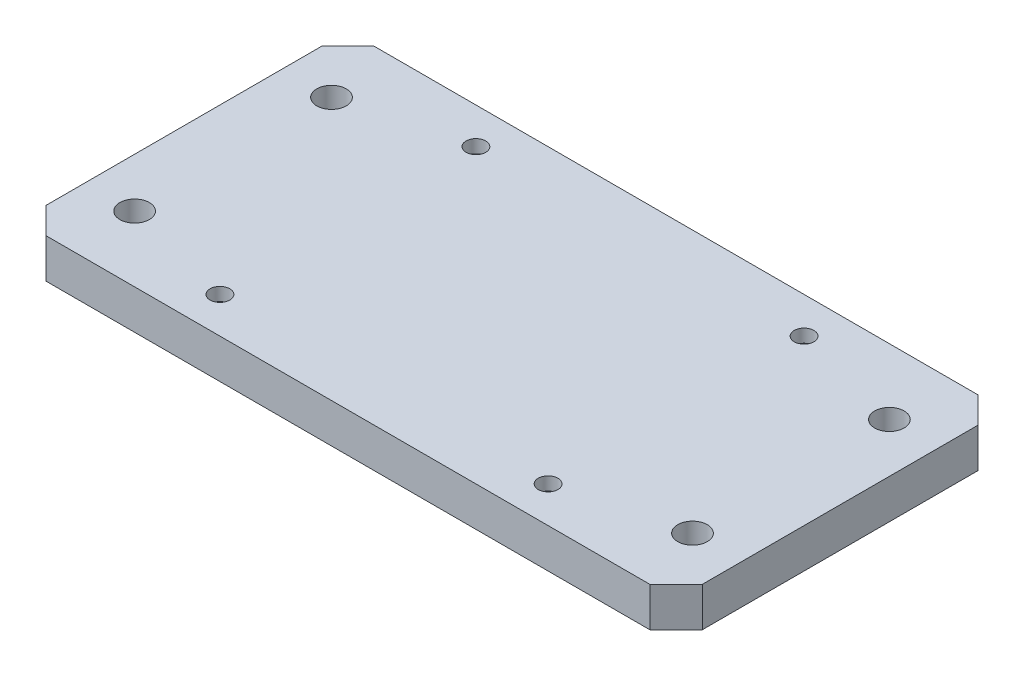
ISO-10303-21;
HEADER;
FILE_DESCRIPTION(('STEP AP214'),'2;1');
FILE_NAME('part.step','',(''),(''),'','','');
FILE_SCHEMA(('AUTOMOTIVE_DESIGN { 1 0 10303 214 1 1 1 1 }'));
ENDSEC;
DATA;
#1=APPLICATION_CONTEXT('core data for automotive mechanical design processes');
#2=APPLICATION_PROTOCOL_DEFINITION('international standard','automotive_design',2000,#1);
#3=PRODUCT_CONTEXT('',#1,'mechanical');
#4=PRODUCT('Part','Part','',(#3));
#5=PRODUCT_RELATED_PRODUCT_CATEGORY('part','',(#4));
#6=PRODUCT_DEFINITION_FORMATION('','',#4);
#7=PRODUCT_DEFINITION_CONTEXT('part definition',#1,'design');
#8=PRODUCT_DEFINITION('design','',#6,#7);
#9=PRODUCT_DEFINITION_SHAPE('','',#8);
#10=(LENGTH_UNIT() NAMED_UNIT(*) SI_UNIT(.MILLI.,.METRE.));
#11=(NAMED_UNIT(*) PLANE_ANGLE_UNIT() SI_UNIT($,.RADIAN.));
#12=(NAMED_UNIT(*) SI_UNIT($,.STERADIAN.) SOLID_ANGLE_UNIT());
#13=UNCERTAINTY_MEASURE_WITH_UNIT(LENGTH_MEASURE(1.E-05),#10,'distance_accuracy_value','');
#14=(GEOMETRIC_REPRESENTATION_CONTEXT(3) GLOBAL_UNCERTAINTY_ASSIGNED_CONTEXT((#13)) GLOBAL_UNIT_ASSIGNED_CONTEXT((#10,
#11,#12)) REPRESENTATION_CONTEXT('',''));
#15=CARTESIAN_POINT('',(0.,0.,0.));
#16=DIRECTION('',(0.,0.,1.));
#17=DIRECTION('',(1.,0.,0.));
#18=AXIS2_PLACEMENT_3D('',#15,#16,#17);
#19=CARTESIAN_POINT('',(-200.,12.,-50.));
#20=DIRECTION('',(1.,0.,0.));
#21=DIRECTION('',(0.,0.,-1.));
#22=AXIS2_PLACEMENT_3D('',#19,#20,#21);
#23=PLANE('',#22);
#24=DIRECTION('',(0.,0.,1.));
#25=VECTOR('',#24,1.);
#26=CARTESIAN_POINT('',(-200.,12.,-50.));
#27=LINE('',#26,#25);
#28=CARTESIAN_POINT('',(-200.,12.,-42.));
#29=VERTEX_POINT('',#28);
#30=CARTESIAN_POINT('',(-200.,12.,42.));
#31=VERTEX_POINT('',#30);
#32=EDGE_CURVE('E127',#29,#31,#27,.T.);
#33=ORIENTED_EDGE('',*,*,#32,.F.);
#34=DIRECTION('',(0.,-1.,0.));
#35=VECTOR('',#34,1.);
#36=CARTESIAN_POINT('',(-200.,12.,-42.));
#37=LINE('',#36,#35);
#38=CARTESIAN_POINT('',(-200.,0.,-42.));
#39=VERTEX_POINT('',#38);
#40=EDGE_CURVE('E11',#29,#39,#37,.T.);
#41=ORIENTED_EDGE('',*,*,#40,.T.);
#42=DIRECTION('',(0.,0.,1.));
#43=VECTOR('',#42,1.);
#44=CARTESIAN_POINT('',(-200.,0.,-50.));
#45=LINE('',#44,#43);
#46=CARTESIAN_POINT('',(-200.,0.,42.));
#47=VERTEX_POINT('',#46);
#48=EDGE_CURVE('E129',#39,#47,#45,.T.);
#49=ORIENTED_EDGE('',*,*,#48,.T.);
#50=DIRECTION('',(0.,1.,0.));
#51=VECTOR('',#50,1.);
#52=CARTESIAN_POINT('',(-200.,12.,42.));
#53=LINE('',#52,#51);
#54=EDGE_CURVE('E40',#47,#31,#53,.T.);
#55=ORIENTED_EDGE('',*,*,#54,.T.);
#56=EDGE_LOOP('',(#33,#41,#49,#55));
#57=FACE_BOUND('',#56,.T.);
#58=ADVANCED_FACE('F32',(#57),#23,.F.);
#59=CARTESIAN_POINT('',(-200.,12.,50.));
#60=DIRECTION('',(0.,0.,-1.));
#61=DIRECTION('',(-1.,0.,0.));
#62=AXIS2_PLACEMENT_3D('',#59,#60,#61);
#63=PLANE('',#62);
#64=DIRECTION('',(1.,0.,0.));
#65=VECTOR('',#64,1.);
#66=CARTESIAN_POINT('',(-200.,0.,50.));
#67=LINE('',#66,#65);
#68=CARTESIAN_POINT('',(-192.,0.,50.));
#69=VERTEX_POINT('',#68);
#70=CARTESIAN_POINT('',(-8.00000000000004,0.,50.));
#71=VERTEX_POINT('',#70);
#72=EDGE_CURVE('E125',#69,#71,#67,.T.);
#73=ORIENTED_EDGE('',*,*,#72,.T.);
#74=DIRECTION('',(0.,1.,0.));
#75=VECTOR('',#74,1.);
#76=CARTESIAN_POINT('',(-8.00000000000004,12.,50.));
#77=LINE('',#76,#75);
#78=CARTESIAN_POINT('',(-7.99999999999999,12.,50.));
#79=VERTEX_POINT('',#78);
#80=EDGE_CURVE('E104',#71,#79,#77,.T.);
#81=ORIENTED_EDGE('',*,*,#80,.T.);
#82=DIRECTION('',(1.,0.,0.));
#83=VECTOR('',#82,1.);
#84=CARTESIAN_POINT('',(-200.,12.,50.));
#85=LINE('',#84,#83);
#86=CARTESIAN_POINT('',(-192.,12.,50.));
#87=VERTEX_POINT('',#86);
#88=EDGE_CURVE('E165',#87,#79,#85,.T.);
#89=ORIENTED_EDGE('',*,*,#88,.F.);
#90=DIRECTION('',(0.,-1.,0.));
#91=VECTOR('',#90,1.);
#92=CARTESIAN_POINT('',(-192.,12.,50.));
#93=LINE('',#92,#91);
#94=EDGE_CURVE('E109',#87,#69,#93,.T.);
#95=ORIENTED_EDGE('',*,*,#94,.T.);
#96=EDGE_LOOP('',(#73,#81,#89,#95));
#97=FACE_BOUND('',#96,.T.);
#98=ADVANCED_FACE('F169',(#97),#63,.F.);
#99=CARTESIAN_POINT('',(0.,12.,-50.));
#100=DIRECTION('',(-1.,0.,0.));
#101=DIRECTION('',(0.,0.,1.));
#102=AXIS2_PLACEMENT_3D('',#99,#100,#101);
#103=PLANE('',#102);
#104=DIRECTION('',(0.,0.,-1.));
#105=VECTOR('',#104,1.);
#106=CARTESIAN_POINT('',(0.,12.,-50.));
#107=LINE('',#106,#105);
#108=CARTESIAN_POINT('',(0.,12.,42.));
#109=VERTEX_POINT('',#108);
#110=CARTESIAN_POINT('',(0.,12.,-42.));
#111=VERTEX_POINT('',#110);
#112=EDGE_CURVE('E118',#109,#111,#107,.T.);
#113=ORIENTED_EDGE('',*,*,#112,.F.);
#114=DIRECTION('',(0.,-1.,0.));
#115=VECTOR('',#114,1.);
#116=CARTESIAN_POINT('',(0.,12.,42.));
#117=LINE('',#116,#115);
#118=CARTESIAN_POINT('',(0.,0.,42.));
#119=VERTEX_POINT('',#118);
#120=EDGE_CURVE('E103',#109,#119,#117,.T.);
#121=ORIENTED_EDGE('',*,*,#120,.T.);
#122=DIRECTION('',(0.,0.,-1.));
#123=VECTOR('',#122,1.);
#124=CARTESIAN_POINT('',(0.,0.,-50.));
#125=LINE('',#124,#123);
#126=CARTESIAN_POINT('',(0.,0.,-42.));
#127=VERTEX_POINT('',#126);
#128=EDGE_CURVE('E116',#119,#127,#125,.T.);
#129=ORIENTED_EDGE('',*,*,#128,.T.);
#130=DIRECTION('',(0.,1.,0.));
#131=VECTOR('',#130,1.);
#132=CARTESIAN_POINT('',(0.,12.,-42.));
#133=LINE('',#132,#131);
#134=EDGE_CURVE('E120',#127,#111,#133,.T.);
#135=ORIENTED_EDGE('',*,*,#134,.T.);
#136=EDGE_LOOP('',(#113,#121,#129,#135));
#137=FACE_BOUND('',#136,.T.);
#138=ADVANCED_FACE('F115',(#137),#103,.F.);
#139=CARTESIAN_POINT('',(-200.,12.,-50.));
#140=DIRECTION('',(0.,0.,1.));
#141=DIRECTION('',(1.,0.,0.));
#142=AXIS2_PLACEMENT_3D('',#139,#140,#141);
#143=PLANE('',#142);
#144=DIRECTION('',(-1.,0.,0.));
#145=VECTOR('',#144,1.);
#146=CARTESIAN_POINT('',(-200.,12.,-50.));
#147=LINE('',#146,#145);
#148=CARTESIAN_POINT('',(-8.00000000000006,12.,-50.));
#149=VERTEX_POINT('',#148);
#150=CARTESIAN_POINT('',(-192.,12.,-50.));
#151=VERTEX_POINT('',#150);
#152=EDGE_CURVE('E133',#149,#151,#147,.T.);
#153=ORIENTED_EDGE('',*,*,#152,.F.);
#154=DIRECTION('',(0.,-1.,0.));
#155=VECTOR('',#154,1.);
#156=CARTESIAN_POINT('',(-8.00000000000004,12.,-50.));
#157=LINE('',#156,#155);
#158=CARTESIAN_POINT('',(-8.00000000000006,0.,-50.));
#159=VERTEX_POINT('',#158);
#160=EDGE_CURVE('E150',#149,#159,#157,.T.);
#161=ORIENTED_EDGE('',*,*,#160,.T.);
#162=DIRECTION('',(-1.,0.,0.));
#163=VECTOR('',#162,1.);
#164=CARTESIAN_POINT('',(-200.,0.,-50.));
#165=LINE('',#164,#163);
#166=CARTESIAN_POINT('',(-192.,0.,-50.));
#167=VERTEX_POINT('',#166);
#168=EDGE_CURVE('E124',#159,#167,#165,.T.);
#169=ORIENTED_EDGE('',*,*,#168,.T.);
#170=DIRECTION('',(0.,1.,0.));
#171=VECTOR('',#170,1.);
#172=CARTESIAN_POINT('',(-192.,12.,-50.));
#173=LINE('',#172,#171);
#174=EDGE_CURVE('E47',#167,#151,#173,.T.);
#175=ORIENTED_EDGE('',*,*,#174,.T.);
#176=EDGE_LOOP('',(#153,#161,#169,#175));
#177=FACE_BOUND('',#176,.T.);
#178=ADVANCED_FACE('F274',(#177),#143,.F.);
#179=CARTESIAN_POINT('',(-200.,12.,50.));
#180=DIRECTION('',(0.,1.,0.));
#181=DIRECTION('',(0.,0.,1.));
#182=AXIS2_PLACEMENT_3D('',#179,#180,#181);
#183=PLANE('',#182);
#184=CARTESIAN_POINT('',(-150.,12.,39.));
#185=DIRECTION('',(0.,-1.,0.));
#186=DIRECTION('',(0.,0.,-1.));
#187=AXIS2_PLACEMENT_3D('',#184,#185,#186);
#188=CIRCLE('',#187,3.);
#189=CARTESIAN_POINT('',(-150.,12.,36.));
#190=VERTEX_POINT('',#189);
#191=EDGE_CURVE('E234',#190,#190,#188,.T.);
#192=ORIENTED_EDGE('',*,*,#191,.T.);
#193=EDGE_LOOP('',(#192));
#194=FACE_BOUND('',#193,.T.);
#195=CARTESIAN_POINT('',(-50.,12.,39.));
#196=DIRECTION('',(0.,-1.,0.));
#197=DIRECTION('',(0.,0.,-1.));
#198=AXIS2_PLACEMENT_3D('',#195,#196,#197);
#199=CIRCLE('',#198,3.);
#200=CARTESIAN_POINT('',(-50.,12.,36.));
#201=VERTEX_POINT('',#200);
#202=EDGE_CURVE('E222',#201,#201,#199,.T.);
#203=ORIENTED_EDGE('',*,*,#202,.T.);
#204=EDGE_LOOP('',(#203));
#205=FACE_BOUND('',#204,.T.);
#206=CARTESIAN_POINT('',(-150.,12.,-39.));
#207=DIRECTION('',(0.,-1.,0.));
#208=DIRECTION('',(0.,0.,-1.));
#209=AXIS2_PLACEMENT_3D('',#206,#207,#208);
#210=CIRCLE('',#209,3.);
#211=CARTESIAN_POINT('',(-150.,12.,-42.));
#212=VERTEX_POINT('',#211);
#213=EDGE_CURVE('E210',#212,#212,#210,.T.);
#214=ORIENTED_EDGE('',*,*,#213,.T.);
#215=EDGE_LOOP('',(#214));
#216=FACE_BOUND('',#215,.T.);
#217=CARTESIAN_POINT('',(-50.,12.,-39.));
#218=DIRECTION('',(0.,-1.,0.));
#219=DIRECTION('',(0.,0.,-1.));
#220=AXIS2_PLACEMENT_3D('',#217,#218,#219);
#221=CIRCLE('',#220,3.);
#222=CARTESIAN_POINT('',(-50.,12.,-42.));
#223=VERTEX_POINT('',#222);
#224=EDGE_CURVE('E198',#223,#223,#221,.T.);
#225=ORIENTED_EDGE('',*,*,#224,.T.);
#226=EDGE_LOOP('',(#225));
#227=FACE_BOUND('',#226,.T.);
#228=CARTESIAN_POINT('',(-185.,12.,30.));
#229=DIRECTION('',(0.,1.,0.));
#230=DIRECTION('',(0.,0.,1.));
#231=AXIS2_PLACEMENT_3D('',#228,#229,#230);
#232=CIRCLE('',#231,4.49999999999998);
#233=CARTESIAN_POINT('',(-185.,12.,34.5));
#234=VERTEX_POINT('',#233);
#235=EDGE_CURVE('E195',#234,#234,#232,.T.);
#236=ORIENTED_EDGE('',*,*,#235,.F.);
#237=EDGE_LOOP('',(#236));
#238=FACE_BOUND('',#237,.T.);
#239=CARTESIAN_POINT('',(-15.,12.,30.));
#240=DIRECTION('',(0.,1.,0.));
#241=DIRECTION('',(0.,0.,1.));
#242=AXIS2_PLACEMENT_3D('',#239,#240,#241);
#243=CIRCLE('',#242,4.49999999999999);
#244=CARTESIAN_POINT('',(-15.,12.,34.5));
#245=VERTEX_POINT('',#244);
#246=EDGE_CURVE('E189',#245,#245,#243,.T.);
#247=ORIENTED_EDGE('',*,*,#246,.F.);
#248=EDGE_LOOP('',(#247));
#249=FACE_BOUND('',#248,.T.);
#250=CARTESIAN_POINT('',(-15.,12.,-30.));
#251=DIRECTION('',(0.,1.,0.));
#252=DIRECTION('',(0.,0.,1.));
#253=AXIS2_PLACEMENT_3D('',#250,#251,#252);
#254=CIRCLE('',#253,4.49999999999999);
#255=CARTESIAN_POINT('',(-15.,12.,-25.5));
#256=VERTEX_POINT('',#255);
#257=EDGE_CURVE('E183',#256,#256,#254,.T.);
#258=ORIENTED_EDGE('',*,*,#257,.F.);
#259=EDGE_LOOP('',(#258));
#260=FACE_BOUND('',#259,.T.);
#261=CARTESIAN_POINT('',(-185.,12.,-30.));
#262=DIRECTION('',(0.,1.,0.));
#263=DIRECTION('',(0.,0.,1.));
#264=AXIS2_PLACEMENT_3D('',#261,#262,#263);
#265=CIRCLE('',#264,4.49999999999998);
#266=CARTESIAN_POINT('',(-185.,12.,-25.5));
#267=VERTEX_POINT('',#266);
#268=EDGE_CURVE('E172',#267,#267,#265,.T.);
#269=ORIENTED_EDGE('',*,*,#268,.F.);
#270=EDGE_LOOP('',(#269));
#271=FACE_BOUND('',#270,.T.);
#272=ORIENTED_EDGE('',*,*,#88,.T.);
#273=DIRECTION('',(-0.707106781186548,0.,0.707106781186547));
#274=VECTOR('',#273,1.);
#275=CARTESIAN_POINT('',(-104.,12.,146.));
#276=LINE('',#275,#274);
#277=EDGE_CURVE('E147',#79,#109,#276,.F.);
#278=ORIENTED_EDGE('',*,*,#277,.T.);
#279=ORIENTED_EDGE('',*,*,#112,.T.);
#280=DIRECTION('',(0.707106781186547,0.,0.707106781186548));
#281=VECTOR('',#280,1.);
#282=CARTESIAN_POINT('',(-53.9999999999999,12.,-95.9999999999999));
#283=LINE('',#282,#281);
#284=EDGE_CURVE('E54',#111,#149,#283,.F.);
#285=ORIENTED_EDGE('',*,*,#284,.T.);
#286=ORIENTED_EDGE('',*,*,#152,.T.);
#287=DIRECTION('',(0.707106781186548,0.,-0.707106781186548));
#288=VECTOR('',#287,1.);
#289=CARTESIAN_POINT('',(-246.,12.,4.00000000000002));
#290=LINE('',#289,#288);
#291=EDGE_CURVE('E144',#151,#29,#290,.F.);
#292=ORIENTED_EDGE('',*,*,#291,.T.);
#293=ORIENTED_EDGE('',*,*,#32,.T.);
#294=DIRECTION('',(-0.707106781186549,0.,-0.707106781186546));
#295=VECTOR('',#294,1.);
#296=CARTESIAN_POINT('',(-196.,12.,46.));
#297=LINE('',#296,#295);
#298=EDGE_CURVE('E142',#31,#87,#297,.F.);
#299=ORIENTED_EDGE('',*,*,#298,.T.);
#300=EDGE_LOOP('',(#272,#278,#279,#285,#286,#292,#293,#299));
#301=FACE_BOUND('',#300,.T.);
#302=ADVANCED_FACE('F162',(#194,#205,#216,#227,#238,#249,#260,#271,#301),#183,.T.);
#303=CARTESIAN_POINT('',(-200.,0.,50.));
#304=DIRECTION('',(0.,1.,0.));
#305=DIRECTION('',(0.,0.,1.));
#306=AXIS2_PLACEMENT_3D('',#303,#304,#305);
#307=PLANE('',#306);
#308=CARTESIAN_POINT('',(-150.,0.,39.));
#309=DIRECTION('',(0.,-1.,0.));
#310=DIRECTION('',(0.,0.,-1.));
#311=AXIS2_PLACEMENT_3D('',#308,#309,#310);
#312=CIRCLE('',#311,5.50000000000001);
#313=CARTESIAN_POINT('',(-150.,0.,33.4999999999999));
#314=VERTEX_POINT('',#313);
#315=EDGE_CURVE('E243',#314,#314,#312,.T.);
#316=ORIENTED_EDGE('',*,*,#315,.F.);
#317=EDGE_LOOP('',(#316));
#318=FACE_BOUND('',#317,.T.);
#319=CARTESIAN_POINT('',(-50.,0.,39.));
#320=DIRECTION('',(0.,-1.,0.));
#321=DIRECTION('',(0.,0.,-1.));
#322=AXIS2_PLACEMENT_3D('',#319,#320,#321);
#323=CIRCLE('',#322,5.5);
#324=CARTESIAN_POINT('',(-50.,0.,33.5));
#325=VERTEX_POINT('',#324);
#326=EDGE_CURVE('E231',#325,#325,#323,.T.);
#327=ORIENTED_EDGE('',*,*,#326,.F.);
#328=EDGE_LOOP('',(#327));
#329=FACE_BOUND('',#328,.T.);
#330=CARTESIAN_POINT('',(-150.,0.,-39.));
#331=DIRECTION('',(0.,-1.,0.));
#332=DIRECTION('',(0.,0.,-1.));
#333=AXIS2_PLACEMENT_3D('',#330,#331,#332);
#334=CIRCLE('',#333,5.50000000000001);
#335=CARTESIAN_POINT('',(-150.,0.,-44.5));
#336=VERTEX_POINT('',#335);
#337=EDGE_CURVE('E219',#336,#336,#334,.T.);
#338=ORIENTED_EDGE('',*,*,#337,.F.);
#339=EDGE_LOOP('',(#338));
#340=FACE_BOUND('',#339,.T.);
#341=CARTESIAN_POINT('',(-50.,0.,-39.));
#342=DIRECTION('',(0.,-1.,0.));
#343=DIRECTION('',(0.,0.,-1.));
#344=AXIS2_PLACEMENT_3D('',#341,#342,#343);
#345=CIRCLE('',#344,5.5);
#346=CARTESIAN_POINT('',(-50.,0.,-44.5));
#347=VERTEX_POINT('',#346);
#348=EDGE_CURVE('E207',#347,#347,#345,.T.);
#349=ORIENTED_EDGE('',*,*,#348,.F.);
#350=EDGE_LOOP('',(#349));
#351=FACE_BOUND('',#350,.T.);
#352=CARTESIAN_POINT('',(-185.,0.,30.));
#353=DIRECTION('',(0.,1.,0.));
#354=DIRECTION('',(0.,0.,1.));
#355=AXIS2_PLACEMENT_3D('',#352,#353,#354);
#356=CIRCLE('',#355,4.5);
#357=CARTESIAN_POINT('',(-185.,0.,34.5));
#358=VERTEX_POINT('',#357);
#359=EDGE_CURVE('E192',#358,#358,#356,.T.);
#360=ORIENTED_EDGE('',*,*,#359,.T.);
#361=EDGE_LOOP('',(#360));
#362=FACE_BOUND('',#361,.T.);
#363=CARTESIAN_POINT('',(-15.,0.,30.));
#364=DIRECTION('',(0.,1.,0.));
#365=DIRECTION('',(0.,0.,1.));
#366=AXIS2_PLACEMENT_3D('',#363,#364,#365);
#367=CIRCLE('',#366,4.5);
#368=CARTESIAN_POINT('',(-15.,0.,34.5));
#369=VERTEX_POINT('',#368);
#370=EDGE_CURVE('E186',#369,#369,#367,.T.);
#371=ORIENTED_EDGE('',*,*,#370,.T.);
#372=EDGE_LOOP('',(#371));
#373=FACE_BOUND('',#372,.T.);
#374=CARTESIAN_POINT('',(-15.,0.,-30.));
#375=DIRECTION('',(0.,1.,0.));
#376=DIRECTION('',(0.,0.,1.));
#377=AXIS2_PLACEMENT_3D('',#374,#375,#376);
#378=CIRCLE('',#377,4.5);
#379=CARTESIAN_POINT('',(-15.,0.,-25.5));
#380=VERTEX_POINT('',#379);
#381=EDGE_CURVE('E180',#380,#380,#378,.T.);
#382=ORIENTED_EDGE('',*,*,#381,.T.);
#383=EDGE_LOOP('',(#382));
#384=FACE_BOUND('',#383,.T.);
#385=CARTESIAN_POINT('',(-185.,0.,-30.));
#386=DIRECTION('',(0.,1.,0.));
#387=DIRECTION('',(0.,0.,1.));
#388=AXIS2_PLACEMENT_3D('',#385,#386,#387);
#389=CIRCLE('',#388,4.5);
#390=CARTESIAN_POINT('',(-185.,0.,-25.5));
#391=VERTEX_POINT('',#390);
#392=EDGE_CURVE('E170',#391,#391,#389,.T.);
#393=ORIENTED_EDGE('',*,*,#392,.T.);
#394=EDGE_LOOP('',(#393));
#395=FACE_BOUND('',#394,.T.);
#396=ORIENTED_EDGE('',*,*,#128,.F.);
#397=DIRECTION('',(0.707106781186548,0.,-0.707106781186547));
#398=VECTOR('',#397,1.);
#399=CARTESIAN_POINT('',(0.,0.,42.));
#400=LINE('',#399,#398);
#401=EDGE_CURVE('E99',#119,#71,#400,.F.);
#402=ORIENTED_EDGE('',*,*,#401,.T.);
#403=ORIENTED_EDGE('',*,*,#72,.F.);
#404=DIRECTION('',(0.707106781186549,0.,0.707106781186546));
#405=VECTOR('',#404,1.);
#406=CARTESIAN_POINT('',(-192.,0.,50.));
#407=LINE('',#406,#405);
#408=EDGE_CURVE('E119',#69,#47,#407,.F.);
#409=ORIENTED_EDGE('',*,*,#408,.T.);
#410=ORIENTED_EDGE('',*,*,#48,.F.);
#411=DIRECTION('',(-0.707106781186548,0.,0.707106781186548));
#412=VECTOR('',#411,1.);
#413=CARTESIAN_POINT('',(-200.,0.,-42.));
#414=LINE('',#413,#412);
#415=EDGE_CURVE('E136',#39,#167,#414,.F.);
#416=ORIENTED_EDGE('',*,*,#415,.T.);
#417=ORIENTED_EDGE('',*,*,#168,.F.);
#418=DIRECTION('',(-0.707106781186547,0.,-0.707106781186548));
#419=VECTOR('',#418,1.);
#420=CARTESIAN_POINT('',(-8.00000000000004,0.,-50.));
#421=LINE('',#420,#419);
#422=EDGE_CURVE('E110',#159,#127,#421,.F.);
#423=ORIENTED_EDGE('',*,*,#422,.T.);
#424=EDGE_LOOP('',(#396,#402,#403,#409,#410,#416,#417,#423));
#425=FACE_BOUND('',#424,.T.);
#426=ADVANCED_FACE('F122',(#318,#329,#340,#351,#362,#373,#384,#395,#425),#307,.F.);
#427=CARTESIAN_POINT('',(-185.,12.,-30.));
#428=DIRECTION('',(0.,1.,0.));
#429=DIRECTION('',(0.,0.,1.));
#430=AXIS2_PLACEMENT_3D('',#427,#428,#429);
#431=CYLINDRICAL_SURFACE('',#430,4.49999999999999);
#432=ORIENTED_EDGE('',*,*,#392,.F.);
#433=EDGE_LOOP('',(#432));
#434=FACE_BOUND('',#433,.T.);
#435=ORIENTED_EDGE('',*,*,#268,.T.);
#436=EDGE_LOOP('',(#435));
#437=FACE_BOUND('',#436,.T.);
#438=ADVANCED_FACE('F251',(#434,#437),#431,.F.);
#439=CARTESIAN_POINT('',(-15.,12.,-30.));
#440=DIRECTION('',(0.,1.,0.));
#441=DIRECTION('',(0.,0.,1.));
#442=AXIS2_PLACEMENT_3D('',#439,#440,#441);
#443=CYLINDRICAL_SURFACE('',#442,4.49999999999999);
#444=ORIENTED_EDGE('',*,*,#381,.F.);
#445=EDGE_LOOP('',(#444));
#446=FACE_BOUND('',#445,.T.);
#447=ORIENTED_EDGE('',*,*,#257,.T.);
#448=EDGE_LOOP('',(#447));
#449=FACE_BOUND('',#448,.T.);
#450=ADVANCED_FACE('F269',(#446,#449),#443,.F.);
#451=CARTESIAN_POINT('',(-15.,12.,30.));
#452=DIRECTION('',(0.,1.,0.));
#453=DIRECTION('',(0.,0.,1.));
#454=AXIS2_PLACEMENT_3D('',#451,#452,#453);
#455=CYLINDRICAL_SURFACE('',#454,4.49999999999999);
#456=ORIENTED_EDGE('',*,*,#370,.F.);
#457=EDGE_LOOP('',(#456));
#458=FACE_BOUND('',#457,.T.);
#459=ORIENTED_EDGE('',*,*,#246,.T.);
#460=EDGE_LOOP('',(#459));
#461=FACE_BOUND('',#460,.T.);
#462=ADVANCED_FACE('F482',(#458,#461),#455,.F.);
#463=CARTESIAN_POINT('',(-185.,12.,30.));
#464=DIRECTION('',(0.,1.,0.));
#465=DIRECTION('',(0.,0.,1.));
#466=AXIS2_PLACEMENT_3D('',#463,#464,#465);
#467=CYLINDRICAL_SURFACE('',#466,4.49999999999999);
#468=ORIENTED_EDGE('',*,*,#359,.F.);
#469=EDGE_LOOP('',(#468));
#470=FACE_BOUND('',#469,.T.);
#471=ORIENTED_EDGE('',*,*,#235,.T.);
#472=EDGE_LOOP('',(#471));
#473=FACE_BOUND('',#472,.T.);
#474=ADVANCED_FACE('F472',(#470,#473),#467,.F.);
#475=CARTESIAN_POINT('',(-50.,0.,-39.));
#476=DIRECTION('',(0.,-1.,0.));
#477=DIRECTION('',(0.,0.,-1.));
#478=AXIS2_PLACEMENT_3D('',#475,#476,#477);
#479=CYLINDRICAL_SURFACE('',#478,3.);
#480=ORIENTED_EDGE('',*,*,#224,.F.);
#481=EDGE_LOOP('',(#480));
#482=FACE_BOUND('',#481,.T.);
#483=CARTESIAN_POINT('',(-50.,8.,-39.));
#484=DIRECTION('',(0.,-1.,0.));
#485=DIRECTION('',(0.,0.,-1.));
#486=AXIS2_PLACEMENT_3D('',#483,#484,#485);
#487=CIRCLE('',#486,3.);
#488=CARTESIAN_POINT('',(-50.,8.,-42.));
#489=VERTEX_POINT('',#488);
#490=EDGE_CURVE('E201',#489,#489,#487,.T.);
#491=ORIENTED_EDGE('',*,*,#490,.T.);
#492=EDGE_LOOP('',(#491));
#493=FACE_BOUND('',#492,.T.);
#494=ADVANCED_FACE('F462',(#482,#493),#479,.F.);
#495=CARTESIAN_POINT('',(-47.,8.,-39.));
#496=DIRECTION('',(0.,1.,0.));
#497=DIRECTION('',(0.,0.,1.));
#498=AXIS2_PLACEMENT_3D('',#495,#496,#497);
#499=PLANE('',#498);
#500=ORIENTED_EDGE('',*,*,#490,.F.);
#501=EDGE_LOOP('',(#500));
#502=FACE_BOUND('',#501,.T.);
#503=CARTESIAN_POINT('',(-50.,8.,-39.));
#504=DIRECTION('',(0.,-1.,0.));
#505=DIRECTION('',(0.,0.,-1.));
#506=AXIS2_PLACEMENT_3D('',#503,#504,#505);
#507=CIRCLE('',#506,5.5);
#508=CARTESIAN_POINT('',(-50.,8.,-44.5));
#509=VERTEX_POINT('',#508);
#510=EDGE_CURVE('E204',#509,#509,#507,.T.);
#511=ORIENTED_EDGE('',*,*,#510,.T.);
#512=EDGE_LOOP('',(#511));
#513=FACE_BOUND('',#512,.T.);
#514=ADVANCED_FACE('F452',(#502,#513),#499,.F.);
#515=CARTESIAN_POINT('',(-50.,0.,-39.));
#516=DIRECTION('',(0.,-1.,0.));
#517=DIRECTION('',(0.,0.,-1.));
#518=AXIS2_PLACEMENT_3D('',#515,#516,#517);
#519=CYLINDRICAL_SURFACE('',#518,5.5);
#520=ORIENTED_EDGE('',*,*,#510,.F.);
#521=EDGE_LOOP('',(#520));
#522=FACE_BOUND('',#521,.T.);
#523=ORIENTED_EDGE('',*,*,#348,.T.);
#524=EDGE_LOOP('',(#523));
#525=FACE_BOUND('',#524,.T.);
#526=ADVANCED_FACE('F442',(#522,#525),#519,.F.);
#527=CARTESIAN_POINT('',(-150.,0.,-39.));
#528=DIRECTION('',(0.,-1.,0.));
#529=DIRECTION('',(0.,0.,-1.));
#530=AXIS2_PLACEMENT_3D('',#527,#528,#529);
#531=CYLINDRICAL_SURFACE('',#530,3.);
#532=ORIENTED_EDGE('',*,*,#213,.F.);
#533=EDGE_LOOP('',(#532));
#534=FACE_BOUND('',#533,.T.);
#535=CARTESIAN_POINT('',(-150.,8.,-39.));
#536=DIRECTION('',(0.,-1.,0.));
#537=DIRECTION('',(0.,0.,-1.));
#538=AXIS2_PLACEMENT_3D('',#535,#536,#537);
#539=CIRCLE('',#538,3.);
#540=CARTESIAN_POINT('',(-150.,8.,-42.));
#541=VERTEX_POINT('',#540);
#542=EDGE_CURVE('E213',#541,#541,#539,.T.);
#543=ORIENTED_EDGE('',*,*,#542,.T.);
#544=EDGE_LOOP('',(#543));
#545=FACE_BOUND('',#544,.T.);
#546=ADVANCED_FACE('F432',(#534,#545),#531,.F.);
#547=CARTESIAN_POINT('',(-147.,8.,-39.));
#548=DIRECTION('',(0.,1.,0.));
#549=DIRECTION('',(0.,0.,1.));
#550=AXIS2_PLACEMENT_3D('',#547,#548,#549);
#551=PLANE('',#550);
#552=ORIENTED_EDGE('',*,*,#542,.F.);
#553=EDGE_LOOP('',(#552));
#554=FACE_BOUND('',#553,.T.);
#555=CARTESIAN_POINT('',(-150.,8.,-39.));
#556=DIRECTION('',(0.,-1.,0.));
#557=DIRECTION('',(0.,0.,-1.));
#558=AXIS2_PLACEMENT_3D('',#555,#556,#557);
#559=CIRCLE('',#558,5.50000000000001);
#560=CARTESIAN_POINT('',(-150.,8.,-44.5));
#561=VERTEX_POINT('',#560);
#562=EDGE_CURVE('E216',#561,#561,#559,.T.);
#563=ORIENTED_EDGE('',*,*,#562,.T.);
#564=EDGE_LOOP('',(#563));
#565=FACE_BOUND('',#564,.T.);
#566=ADVANCED_FACE('F422',(#554,#565),#551,.F.);
#567=CARTESIAN_POINT('',(-150.,0.,-39.));
#568=DIRECTION('',(0.,-1.,0.));
#569=DIRECTION('',(0.,0.,-1.));
#570=AXIS2_PLACEMENT_3D('',#567,#568,#569);
#571=CYLINDRICAL_SURFACE('',#570,5.50000000000001);
#572=ORIENTED_EDGE('',*,*,#562,.F.);
#573=EDGE_LOOP('',(#572));
#574=FACE_BOUND('',#573,.T.);
#575=ORIENTED_EDGE('',*,*,#337,.T.);
#576=EDGE_LOOP('',(#575));
#577=FACE_BOUND('',#576,.T.);
#578=ADVANCED_FACE('F412',(#574,#577),#571,.F.);
#579=CARTESIAN_POINT('',(-50.,0.,39.));
#580=DIRECTION('',(0.,-1.,0.));
#581=DIRECTION('',(0.,0.,-1.));
#582=AXIS2_PLACEMENT_3D('',#579,#580,#581);
#583=CYLINDRICAL_SURFACE('',#582,3.);
#584=ORIENTED_EDGE('',*,*,#202,.F.);
#585=EDGE_LOOP('',(#584));
#586=FACE_BOUND('',#585,.T.);
#587=CARTESIAN_POINT('',(-50.,8.,39.));
#588=DIRECTION('',(0.,-1.,0.));
#589=DIRECTION('',(0.,0.,-1.));
#590=AXIS2_PLACEMENT_3D('',#587,#588,#589);
#591=CIRCLE('',#590,3.);
#592=CARTESIAN_POINT('',(-50.,8.,36.));
#593=VERTEX_POINT('',#592);
#594=EDGE_CURVE('E225',#593,#593,#591,.T.);
#595=ORIENTED_EDGE('',*,*,#594,.T.);
#596=EDGE_LOOP('',(#595));
#597=FACE_BOUND('',#596,.T.);
#598=ADVANCED_FACE('F402',(#586,#597),#583,.F.);
#599=CARTESIAN_POINT('',(-47.,8.,39.));
#600=DIRECTION('',(0.,1.,0.));
#601=DIRECTION('',(0.,0.,1.));
#602=AXIS2_PLACEMENT_3D('',#599,#600,#601);
#603=PLANE('',#602);
#604=ORIENTED_EDGE('',*,*,#594,.F.);
#605=EDGE_LOOP('',(#604));
#606=FACE_BOUND('',#605,.T.);
#607=CARTESIAN_POINT('',(-50.,8.,39.));
#608=DIRECTION('',(0.,-1.,0.));
#609=DIRECTION('',(0.,0.,-1.));
#610=AXIS2_PLACEMENT_3D('',#607,#608,#609);
#611=CIRCLE('',#610,5.5);
#612=CARTESIAN_POINT('',(-50.,8.,33.5));
#613=VERTEX_POINT('',#612);
#614=EDGE_CURVE('E228',#613,#613,#611,.T.);
#615=ORIENTED_EDGE('',*,*,#614,.T.);
#616=EDGE_LOOP('',(#615));
#617=FACE_BOUND('',#616,.T.);
#618=ADVANCED_FACE('F392',(#606,#617),#603,.F.);
#619=CARTESIAN_POINT('',(-50.,0.,39.));
#620=DIRECTION('',(0.,-1.,0.));
#621=DIRECTION('',(0.,0.,-1.));
#622=AXIS2_PLACEMENT_3D('',#619,#620,#621);
#623=CYLINDRICAL_SURFACE('',#622,5.5);
#624=ORIENTED_EDGE('',*,*,#614,.F.);
#625=EDGE_LOOP('',(#624));
#626=FACE_BOUND('',#625,.T.);
#627=ORIENTED_EDGE('',*,*,#326,.T.);
#628=EDGE_LOOP('',(#627));
#629=FACE_BOUND('',#628,.T.);
#630=ADVANCED_FACE('F382',(#626,#629),#623,.F.);
#631=CARTESIAN_POINT('',(-150.,0.,39.));
#632=DIRECTION('',(0.,-1.,0.));
#633=DIRECTION('',(0.,0.,-1.));
#634=AXIS2_PLACEMENT_3D('',#631,#632,#633);
#635=CYLINDRICAL_SURFACE('',#634,3.);
#636=ORIENTED_EDGE('',*,*,#191,.F.);
#637=EDGE_LOOP('',(#636));
#638=FACE_BOUND('',#637,.T.);
#639=CARTESIAN_POINT('',(-150.,8.,39.));
#640=DIRECTION('',(0.,-1.,0.));
#641=DIRECTION('',(0.,0.,-1.));
#642=AXIS2_PLACEMENT_3D('',#639,#640,#641);
#643=CIRCLE('',#642,3.);
#644=CARTESIAN_POINT('',(-150.,8.,36.));
#645=VERTEX_POINT('',#644);
#646=EDGE_CURVE('E237',#645,#645,#643,.T.);
#647=ORIENTED_EDGE('',*,*,#646,.T.);
#648=EDGE_LOOP('',(#647));
#649=FACE_BOUND('',#648,.T.);
#650=ADVANCED_FACE('F372',(#638,#649),#635,.F.);
#651=CARTESIAN_POINT('',(-147.,8.,39.));
#652=DIRECTION('',(0.,1.,0.));
#653=DIRECTION('',(0.,0.,1.));
#654=AXIS2_PLACEMENT_3D('',#651,#652,#653);
#655=PLANE('',#654);
#656=ORIENTED_EDGE('',*,*,#646,.F.);
#657=EDGE_LOOP('',(#656));
#658=FACE_BOUND('',#657,.T.);
#659=CARTESIAN_POINT('',(-150.,8.,39.));
#660=DIRECTION('',(0.,-1.,0.));
#661=DIRECTION('',(0.,0.,-1.));
#662=AXIS2_PLACEMENT_3D('',#659,#660,#661);
#663=CIRCLE('',#662,5.50000000000001);
#664=CARTESIAN_POINT('',(-150.,8.,33.4999999999999));
#665=VERTEX_POINT('',#664);
#666=EDGE_CURVE('E240',#665,#665,#663,.T.);
#667=ORIENTED_EDGE('',*,*,#666,.T.);
#668=EDGE_LOOP('',(#667));
#669=FACE_BOUND('',#668,.T.);
#670=ADVANCED_FACE('F362',(#658,#669),#655,.F.);
#671=CARTESIAN_POINT('',(-150.,0.,39.));
#672=DIRECTION('',(0.,-1.,0.));
#673=DIRECTION('',(0.,0.,-1.));
#674=AXIS2_PLACEMENT_3D('',#671,#672,#673);
#675=CYLINDRICAL_SURFACE('',#674,5.50000000000001);
#676=ORIENTED_EDGE('',*,*,#666,.F.);
#677=EDGE_LOOP('',(#676));
#678=FACE_BOUND('',#677,.T.);
#679=ORIENTED_EDGE('',*,*,#315,.T.);
#680=EDGE_LOOP('',(#679));
#681=FACE_BOUND('',#680,.T.);
#682=ADVANCED_FACE('F247',(#678,#681),#675,.F.);
#683=CARTESIAN_POINT('',(0.,12.,42.));
#684=DIRECTION('',(-0.707106781186547,0.,-0.707106781186548));
#685=DIRECTION('',(-0.707106781186548,0.,0.707106781186547));
#686=AXIS2_PLACEMENT_3D('',#683,#684,#685);
#687=PLANE('',#686);
#688=ORIENTED_EDGE('',*,*,#277,.F.);
#689=ORIENTED_EDGE('',*,*,#80,.F.);
#690=ORIENTED_EDGE('',*,*,#401,.F.);
#691=ORIENTED_EDGE('',*,*,#120,.F.);
#692=EDGE_LOOP('',(#688,#689,#690,#691));
#693=FACE_BOUND('',#692,.T.);
#694=ADVANCED_FACE('F102',(#693),#687,.F.);
#695=CARTESIAN_POINT('',(-8.00000000000004,12.,-50.));
#696=DIRECTION('',(-0.707106781186548,0.,0.707106781186547));
#697=DIRECTION('',(0.707106781186547,0.,0.707106781186548));
#698=AXIS2_PLACEMENT_3D('',#695,#696,#697);
#699=PLANE('',#698);
#700=ORIENTED_EDGE('',*,*,#284,.F.);
#701=ORIENTED_EDGE('',*,*,#134,.F.);
#702=ORIENTED_EDGE('',*,*,#422,.F.);
#703=ORIENTED_EDGE('',*,*,#160,.F.);
#704=EDGE_LOOP('',(#700,#701,#702,#703));
#705=FACE_BOUND('',#704,.T.);
#706=ADVANCED_FACE('F292',(#705),#699,.F.);
#707=CARTESIAN_POINT('',(-200.,12.,-42.));
#708=DIRECTION('',(0.707106781186548,0.,0.707106781186548));
#709=DIRECTION('',(0.707106781186548,0.,-0.707106781186548));
#710=AXIS2_PLACEMENT_3D('',#707,#708,#709);
#711=PLANE('',#710);
#712=ORIENTED_EDGE('',*,*,#291,.F.);
#713=ORIENTED_EDGE('',*,*,#174,.F.);
#714=ORIENTED_EDGE('',*,*,#415,.F.);
#715=ORIENTED_EDGE('',*,*,#40,.F.);
#716=EDGE_LOOP('',(#712,#713,#714,#715));
#717=FACE_BOUND('',#716,.T.);
#718=ADVANCED_FACE('F294',(#717),#711,.F.);
#719=CARTESIAN_POINT('',(-192.,12.,50.));
#720=DIRECTION('',(0.707106781186546,0.,-0.707106781186549));
#721=DIRECTION('',(-0.707106781186549,0.,-0.707106781186546));
#722=AXIS2_PLACEMENT_3D('',#719,#720,#721);
#723=PLANE('',#722);
#724=ORIENTED_EDGE('',*,*,#298,.F.);
#725=ORIENTED_EDGE('',*,*,#54,.F.);
#726=ORIENTED_EDGE('',*,*,#408,.F.);
#727=ORIENTED_EDGE('',*,*,#94,.F.);
#728=EDGE_LOOP('',(#724,#725,#726,#727));
#729=FACE_BOUND('',#728,.T.);
#730=ADVANCED_FACE('F34',(#729),#723,.F.);
#731=CLOSED_SHELL('',(#58,#98,#138,#178,#302,#426,#438,#450,#462,#474,#494,#514,#526,#546,#566,
#578,#598,#618,#630,#650,#670,#682,#694,#706,#718,#730));
#732=MANIFOLD_SOLID_BREP('B2',#731);
#733=ADVANCED_BREP_SHAPE_REPRESENTATION('',(#18,#732),#14);
#734=SHAPE_DEFINITION_REPRESENTATION(#9,#733);
ENDSEC;
END-ISO-10303-21;
